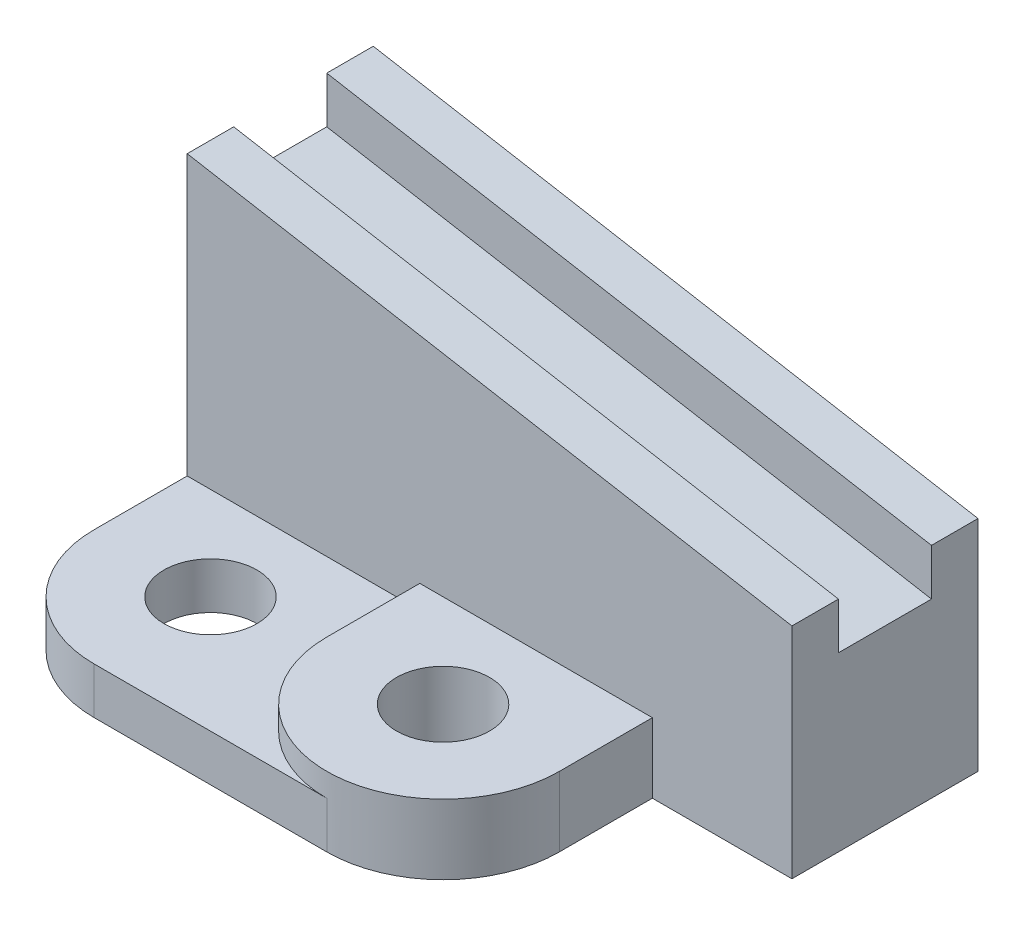
ISO-10303-21;
HEADER;
FILE_DESCRIPTION(('STEP AP214'),'2;1');
FILE_NAME('part.step','',(''),(''),'','','');
FILE_SCHEMA(('AUTOMOTIVE_DESIGN { 1 0 10303 214 1 1 1 1 }'));
ENDSEC;
DATA;
#1=APPLICATION_CONTEXT('core data for automotive mechanical design processes');
#2=APPLICATION_PROTOCOL_DEFINITION('international standard','automotive_design',2000,#1);
#3=PRODUCT_CONTEXT('',#1,'mechanical');
#4=PRODUCT('Part','Part','',(#3));
#5=PRODUCT_RELATED_PRODUCT_CATEGORY('part','',(#4));
#6=PRODUCT_DEFINITION_FORMATION('','',#4);
#7=PRODUCT_DEFINITION_CONTEXT('part definition',#1,'design');
#8=PRODUCT_DEFINITION('design','',#6,#7);
#9=PRODUCT_DEFINITION_SHAPE('','',#8);
#10=(LENGTH_UNIT() NAMED_UNIT(*) SI_UNIT(.MILLI.,.METRE.));
#11=(NAMED_UNIT(*) PLANE_ANGLE_UNIT() SI_UNIT($,.RADIAN.));
#12=(NAMED_UNIT(*) SI_UNIT($,.STERADIAN.) SOLID_ANGLE_UNIT());
#13=UNCERTAINTY_MEASURE_WITH_UNIT(LENGTH_MEASURE(1.E-05),#10,'distance_accuracy_value','');
#14=(GEOMETRIC_REPRESENTATION_CONTEXT(3) GLOBAL_UNCERTAINTY_ASSIGNED_CONTEXT((#13)) GLOBAL_UNIT_ASSIGNED_CONTEXT((#10,
#11,#12)) REPRESENTATION_CONTEXT('',''));
#15=CARTESIAN_POINT('',(0.,0.,0.));
#16=DIRECTION('',(0.,0.,1.));
#17=DIRECTION('',(1.,0.,0.));
#18=AXIS2_PLACEMENT_3D('',#15,#16,#17);
#19=CARTESIAN_POINT('',(0.,70.,40.));
#20=DIRECTION('',(0.,0.,-1.));
#21=DIRECTION('',(-1.,0.,0.));
#22=AXIS2_PLACEMENT_3D('',#19,#20,#21);
#23=PLANE('',#22);
#24=DIRECTION('',(1.,0.,0.));
#25=VECTOR('',#24,1.);
#26=CARTESIAN_POINT('',(0.,15.,40.));
#27=LINE('',#26,#25);
#28=CARTESIAN_POINT('',(50.,15.,40.));
#29=VERTEX_POINT('',#28);
#30=CARTESIAN_POINT('',(100.,15.,40.));
#31=VERTEX_POINT('',#30);
#32=EDGE_CURVE('E159',#29,#31,#27,.T.);
#33=ORIENTED_EDGE('',*,*,#32,.T.);
#34=DIRECTION('',(0.,-1.,0.));
#35=VECTOR('',#34,1.);
#36=CARTESIAN_POINT('',(100.,10.,40.));
#37=LINE('',#36,#35);
#38=CARTESIAN_POINT('',(100.,0.,40.));
#39=VERTEX_POINT('',#38);
#40=EDGE_CURVE('E51',#31,#39,#37,.T.);
#41=ORIENTED_EDGE('',*,*,#40,.T.);
#42=DIRECTION('',(1.,0.,0.));
#43=VECTOR('',#42,1.);
#44=CARTESIAN_POINT('',(0.,0.,40.));
#45=LINE('',#44,#43);
#46=CARTESIAN_POINT('',(130.,0.,40.));
#47=VERTEX_POINT('',#46);
#48=EDGE_CURVE('E236',#39,#47,#45,.T.);
#49=ORIENTED_EDGE('',*,*,#48,.T.);
#50=DIRECTION('',(0.,-1.,0.));
#51=VECTOR('',#50,1.);
#52=CARTESIAN_POINT('',(130.,70.,40.));
#53=LINE('',#52,#51);
#54=CARTESIAN_POINT('',(130.,47.0774925079001,40.));
#55=VERTEX_POINT('',#54);
#56=EDGE_CURVE('E245',#55,#47,#53,.T.);
#57=ORIENTED_EDGE('',*,*,#56,.F.);
#58=DIRECTION('',(-0.984807753012209,0.173648177666927,0.));
#59=VECTOR('',#58,1.);
#60=CARTESIAN_POINT('',(0.,70.,40.));
#61=LINE('',#60,#59);
#62=CARTESIAN_POINT('',(0.,70.,40.));
#63=VERTEX_POINT('',#62);
#64=EDGE_CURVE('E223',#55,#63,#61,.T.);
#65=ORIENTED_EDGE('',*,*,#64,.T.);
#66=DIRECTION('',(0.,-1.,0.));
#67=VECTOR('',#66,1.);
#68=CARTESIAN_POINT('',(0.,70.,40.));
#69=LINE('',#68,#67);
#70=CARTESIAN_POINT('',(0.,10.,40.));
#71=VERTEX_POINT('',#70);
#72=EDGE_CURVE('E243',#63,#71,#69,.T.);
#73=ORIENTED_EDGE('',*,*,#72,.T.);
#74=DIRECTION('',(1.,0.,0.));
#75=VECTOR('',#74,1.);
#76=CARTESIAN_POINT('',(0.,10.,40.));
#77=LINE('',#76,#75);
#78=CARTESIAN_POINT('',(50.,10.,40.));
#79=VERTEX_POINT('',#78);
#80=EDGE_CURVE('E177',#71,#79,#77,.T.);
#81=ORIENTED_EDGE('',*,*,#80,.T.);
#82=DIRECTION('',(0.,-1.,0.));
#83=VECTOR('',#82,1.);
#84=CARTESIAN_POINT('',(50.,15.,40.));
#85=LINE('',#84,#83);
#86=EDGE_CURVE('E58',#29,#79,#85,.T.);
#87=ORIENTED_EDGE('',*,*,#86,.F.);
#88=EDGE_LOOP('',(#33,#41,#49,#57,#65,#73,#81,#87));
#89=FACE_BOUND('',#88,.T.);
#90=ADVANCED_FACE('F36',(#89),#23,.F.);
#91=CARTESIAN_POINT('',(0.,10.,0.));
#92=DIRECTION('',(0.,1.,0.));
#93=DIRECTION('',(0.,0.,1.));
#94=AXIS2_PLACEMENT_3D('',#91,#92,#93);
#95=PLANE('',#94);
#96=CARTESIAN_POINT('',(25.,10.,60.));
#97=DIRECTION('',(0.,1.,0.));
#98=DIRECTION('',(0.,0.,1.));
#99=AXIS2_PLACEMENT_3D('',#96,#97,#98);
#100=CIRCLE('',#99,10.);
#101=CARTESIAN_POINT('',(25.,10.,70.));
#102=VERTEX_POINT('',#101);
#103=EDGE_CURVE('E184',#102,#102,#100,.T.);
#104=ORIENTED_EDGE('',*,*,#103,.F.);
#105=EDGE_LOOP('',(#104));
#106=FACE_BOUND('',#105,.T.);
#107=DIRECTION('',(1.,0.,0.));
#108=VECTOR('',#107,1.);
#109=CARTESIAN_POINT('',(0.,10.,85.));
#110=LINE('',#109,#108);
#111=CARTESIAN_POINT('',(25.,10.,85.));
#112=VERTEX_POINT('',#111);
#113=CARTESIAN_POINT('',(75.,10.,85.));
#114=VERTEX_POINT('',#113);
#115=EDGE_CURVE('E175',#112,#114,#110,.T.);
#116=ORIENTED_EDGE('',*,*,#115,.T.);
#117=CARTESIAN_POINT('',(75.,10.,60.));
#118=DIRECTION('',(0.,1.,0.));
#119=DIRECTION('',(0.,0.,1.));
#120=AXIS2_PLACEMENT_3D('',#117,#118,#119);
#121=CIRCLE('',#120,25.);
#122=CARTESIAN_POINT('',(50.,10.,60.));
#123=VERTEX_POINT('',#122);
#124=EDGE_CURVE('E11',#114,#123,#121,.F.);
#125=ORIENTED_EDGE('',*,*,#124,.T.);
#126=DIRECTION('',(0.,0.,1.));
#127=VECTOR('',#126,1.);
#128=CARTESIAN_POINT('',(50.,10.,0.));
#129=LINE('',#128,#127);
#130=EDGE_CURVE('E44',#79,#123,#129,.T.);
#131=ORIENTED_EDGE('',*,*,#130,.F.);
#132=ORIENTED_EDGE('',*,*,#80,.F.);
#133=DIRECTION('',(0.,0.,1.));
#134=VECTOR('',#133,1.);
#135=CARTESIAN_POINT('',(0.,10.,0.));
#136=LINE('',#135,#134);
#137=CARTESIAN_POINT('',(0.,10.,60.));
#138=VERTEX_POINT('',#137);
#139=EDGE_CURVE('E180',#71,#138,#136,.T.);
#140=ORIENTED_EDGE('',*,*,#139,.T.);
#141=CARTESIAN_POINT('',(25.,10.,60.));
#142=DIRECTION('',(0.,1.,0.));
#143=DIRECTION('',(0.,0.,1.));
#144=AXIS2_PLACEMENT_3D('',#141,#142,#143);
#145=CIRCLE('',#144,25.);
#146=EDGE_CURVE('E182',#138,#112,#145,.T.);
#147=ORIENTED_EDGE('',*,*,#146,.T.);
#148=EDGE_LOOP('',(#116,#125,#131,#132,#140,#147));
#149=FACE_BOUND('',#148,.T.);
#150=ADVANCED_FACE('F280',(#106,#149),#95,.T.);
#151=CARTESIAN_POINT('',(0.,70.,0.));
#152=DIRECTION('',(1.,0.,0.));
#153=DIRECTION('',(0.,0.,-1.));
#154=AXIS2_PLACEMENT_3D('',#151,#152,#153);
#155=PLANE('',#154);
#156=DIRECTION('',(0.,0.,1.));
#157=VECTOR('',#156,1.);
#158=CARTESIAN_POINT('',(0.,0.,0.));
#159=LINE('',#158,#157);
#160=CARTESIAN_POINT('',(0.,0.,0.));
#161=VERTEX_POINT('',#160);
#162=CARTESIAN_POINT('',(0.,0.,60.));
#163=VERTEX_POINT('',#162);
#164=EDGE_CURVE('E248',#161,#163,#159,.T.);
#165=ORIENTED_EDGE('',*,*,#164,.T.);
#166=DIRECTION('',(0.,-1.,0.));
#167=VECTOR('',#166,1.);
#168=CARTESIAN_POINT('',(0.,10.,60.));
#169=LINE('',#168,#167);
#170=EDGE_CURVE('E202',#138,#163,#169,.T.);
#171=ORIENTED_EDGE('',*,*,#170,.F.);
#172=ORIENTED_EDGE('',*,*,#139,.F.);
#173=ORIENTED_EDGE('',*,*,#72,.F.);
#174=DIRECTION('',(0.,0.,1.));
#175=VECTOR('',#174,1.);
#176=CARTESIAN_POINT('',(0.,70.,0.));
#177=LINE('',#176,#175);
#178=CARTESIAN_POINT('',(0.,70.,30.));
#179=VERTEX_POINT('',#178);
#180=EDGE_CURVE('E238',#179,#63,#177,.T.);
#181=ORIENTED_EDGE('',*,*,#180,.F.);
#182=DIRECTION('',(0.,-1.,0.));
#183=VECTOR('',#182,1.);
#184=CARTESIAN_POINT('',(0.,70.,30.));
#185=LINE('',#184,#183);
#186=CARTESIAN_POINT('',(0.,60.,30.));
#187=VERTEX_POINT('',#186);
#188=EDGE_CURVE('E239',#179,#187,#185,.T.);
#189=ORIENTED_EDGE('',*,*,#188,.T.);
#190=DIRECTION('',(0.,0.,1.));
#191=VECTOR('',#190,1.);
#192=CARTESIAN_POINT('',(0.,60.,10.));
#193=LINE('',#192,#191);
#194=CARTESIAN_POINT('',(0.,60.,10.));
#195=VERTEX_POINT('',#194);
#196=EDGE_CURVE('E210',#195,#187,#193,.T.);
#197=ORIENTED_EDGE('',*,*,#196,.F.);
#198=DIRECTION('',(0.,-1.,0.));
#199=VECTOR('',#198,1.);
#200=CARTESIAN_POINT('',(0.,70.,10.));
#201=LINE('',#200,#199);
#202=CARTESIAN_POINT('',(0.,70.,10.));
#203=VERTEX_POINT('',#202);
#204=EDGE_CURVE('E265',#203,#195,#201,.T.);
#205=ORIENTED_EDGE('',*,*,#204,.F.);
#206=DIRECTION('',(0.,0.,1.));
#207=VECTOR('',#206,1.);
#208=CARTESIAN_POINT('',(0.,70.,0.));
#209=LINE('',#208,#207);
#210=CARTESIAN_POINT('',(0.,70.,0.));
#211=VERTEX_POINT('',#210);
#212=EDGE_CURVE('E249',#211,#203,#209,.T.);
#213=ORIENTED_EDGE('',*,*,#212,.F.);
#214=DIRECTION('',(0.,-1.,0.));
#215=VECTOR('',#214,1.);
#216=CARTESIAN_POINT('',(0.,70.,0.));
#217=LINE('',#216,#215);
#218=EDGE_CURVE('E251',#211,#161,#217,.T.);
#219=ORIENTED_EDGE('',*,*,#218,.T.);
#220=EDGE_LOOP('',(#165,#171,#172,#173,#181,#189,#197,#205,#213,#219));
#221=FACE_BOUND('',#220,.T.);
#222=ADVANCED_FACE('F38',(#221),#155,.F.);
#223=CARTESIAN_POINT('',(0.,70.,10.));
#224=DIRECTION('',(0.,0.,-1.));
#225=DIRECTION('',(-1.,0.,0.));
#226=AXIS2_PLACEMENT_3D('',#223,#224,#225);
#227=PLANE('',#226);
#228=ORIENTED_EDGE('',*,*,#204,.T.);
#229=DIRECTION('',(-0.984807753012209,0.173648177666926,0.));
#230=VECTOR('',#229,1.);
#231=CARTESIAN_POINT('',(0.,60.,10.));
#232=LINE('',#231,#230);
#233=CARTESIAN_POINT('',(130.,37.0774925079001,10.));
#234=VERTEX_POINT('',#233);
#235=EDGE_CURVE('E207',#234,#195,#232,.T.);
#236=ORIENTED_EDGE('',*,*,#235,.F.);
#237=DIRECTION('',(0.,-1.,0.));
#238=VECTOR('',#237,1.);
#239=CARTESIAN_POINT('',(130.,70.,10.));
#240=LINE('',#239,#238);
#241=CARTESIAN_POINT('',(130.,47.0774925079001,10.));
#242=VERTEX_POINT('',#241);
#243=EDGE_CURVE('E262',#242,#234,#240,.T.);
#244=ORIENTED_EDGE('',*,*,#243,.F.);
#245=DIRECTION('',(-0.984807753012209,0.173648177666927,0.));
#246=VECTOR('',#245,1.);
#247=CARTESIAN_POINT('',(0.,70.,10.));
#248=LINE('',#247,#246);
#249=EDGE_CURVE('E230',#242,#203,#248,.T.);
#250=ORIENTED_EDGE('',*,*,#249,.T.);
#251=EDGE_LOOP('',(#228,#236,#244,#250));
#252=FACE_BOUND('',#251,.T.);
#253=ADVANCED_FACE('F309',(#252),#227,.F.);
#254=CARTESIAN_POINT('',(130.,70.,0.));
#255=DIRECTION('',(1.,0.,0.));
#256=DIRECTION('',(0.,0.,-1.));
#257=AXIS2_PLACEMENT_3D('',#254,#255,#256);
#258=PLANE('',#257);
#259=DIRECTION('',(0.,0.,1.));
#260=VECTOR('',#259,1.);
#261=CARTESIAN_POINT('',(130.,37.0774925079001,0.));
#262=LINE('',#261,#260);
#263=CARTESIAN_POINT('',(130.,37.0774925079001,30.));
#264=VERTEX_POINT('',#263);
#265=EDGE_CURVE('E233',#234,#264,#262,.T.);
#266=ORIENTED_EDGE('',*,*,#265,.T.);
#267=DIRECTION('',(0.,-1.,0.));
#268=VECTOR('',#267,1.);
#269=CARTESIAN_POINT('',(130.,70.,30.));
#270=LINE('',#269,#268);
#271=CARTESIAN_POINT('',(130.,47.0774925079001,30.));
#272=VERTEX_POINT('',#271);
#273=EDGE_CURVE('E242',#272,#264,#270,.T.);
#274=ORIENTED_EDGE('',*,*,#273,.F.);
#275=DIRECTION('',(0.,0.,1.));
#276=VECTOR('',#275,1.);
#277=CARTESIAN_POINT('',(130.,47.0774925079001,0.));
#278=LINE('',#277,#276);
#279=EDGE_CURVE('E219',#272,#55,#278,.T.);
#280=ORIENTED_EDGE('',*,*,#279,.T.);
#281=ORIENTED_EDGE('',*,*,#56,.T.);
#282=DIRECTION('',(0.,0.,1.));
#283=VECTOR('',#282,1.);
#284=CARTESIAN_POINT('',(130.,0.,0.));
#285=LINE('',#284,#283);
#286=CARTESIAN_POINT('',(130.,0.,0.));
#287=VERTEX_POINT('',#286);
#288=EDGE_CURVE('E254',#287,#47,#285,.T.);
#289=ORIENTED_EDGE('',*,*,#288,.F.);
#290=DIRECTION('',(0.,-1.,0.));
#291=VECTOR('',#290,1.);
#292=CARTESIAN_POINT('',(130.,70.,0.));
#293=LINE('',#292,#291);
#294=CARTESIAN_POINT('',(130.,47.0774925079001,0.));
#295=VERTEX_POINT('',#294);
#296=EDGE_CURVE('E260',#295,#287,#293,.T.);
#297=ORIENTED_EDGE('',*,*,#296,.F.);
#298=EDGE_CURVE('E220',#295,#242,#278,.T.);
#299=ORIENTED_EDGE('',*,*,#298,.T.);
#300=ORIENTED_EDGE('',*,*,#243,.T.);
#301=EDGE_LOOP('',(#266,#274,#280,#281,#289,#297,#299,#300));
#302=FACE_BOUND('',#301,.T.);
#303=ADVANCED_FACE('F297',(#302),#258,.T.);
#304=CARTESIAN_POINT('',(0.,70.,0.));
#305=DIRECTION('',(0.,0.,-1.));
#306=DIRECTION('',(-1.,0.,0.));
#307=AXIS2_PLACEMENT_3D('',#304,#305,#306);
#308=PLANE('',#307);
#309=DIRECTION('',(0.984807753012209,-0.173648177666927,0.));
#310=VECTOR('',#309,1.);
#311=CARTESIAN_POINT('',(11.9707050163981,67.8892417275069,0.));
#312=LINE('',#311,#310);
#313=EDGE_CURVE('E216',#211,#295,#312,.T.);
#314=ORIENTED_EDGE('',*,*,#313,.T.);
#315=ORIENTED_EDGE('',*,*,#296,.T.);
#316=DIRECTION('',(1.,0.,0.));
#317=VECTOR('',#316,1.);
#318=CARTESIAN_POINT('',(0.,0.,0.));
#319=LINE('',#318,#317);
#320=EDGE_CURVE('E252',#161,#287,#319,.T.);
#321=ORIENTED_EDGE('',*,*,#320,.F.);
#322=ORIENTED_EDGE('',*,*,#218,.F.);
#323=EDGE_LOOP('',(#314,#315,#321,#322));
#324=FACE_BOUND('',#323,.T.);
#325=ADVANCED_FACE('F303',(#324),#308,.T.);
#326=CARTESIAN_POINT('',(0.,0.,0.));
#327=DIRECTION('',(0.,1.,0.));
#328=DIRECTION('',(0.,0.,1.));
#329=AXIS2_PLACEMENT_3D('',#326,#327,#328);
#330=PLANE('',#329);
#331=CARTESIAN_POINT('',(75.,0.,60.));
#332=DIRECTION('',(0.,1.,0.));
#333=DIRECTION('',(0.,0.,1.));
#334=AXIS2_PLACEMENT_3D('',#331,#332,#333);
#335=CIRCLE('',#334,25.);
#336=CARTESIAN_POINT('',(75.,0.,85.));
#337=VERTEX_POINT('',#336);
#338=CARTESIAN_POINT('',(100.,0.,60.));
#339=VERTEX_POINT('',#338);
#340=EDGE_CURVE('E151',#337,#339,#335,.T.);
#341=ORIENTED_EDGE('',*,*,#340,.F.);
#342=DIRECTION('',(1.,0.,0.));
#343=VECTOR('',#342,1.);
#344=CARTESIAN_POINT('',(0.,0.,85.));
#345=LINE('',#344,#343);
#346=CARTESIAN_POINT('',(25.,0.,85.));
#347=VERTEX_POINT('',#346);
#348=EDGE_CURVE('E174',#347,#337,#345,.T.);
#349=ORIENTED_EDGE('',*,*,#348,.F.);
#350=CARTESIAN_POINT('',(25.,0.,60.));
#351=DIRECTION('',(0.,1.,0.));
#352=DIRECTION('',(0.,0.,1.));
#353=AXIS2_PLACEMENT_3D('',#350,#351,#352);
#354=CIRCLE('',#353,25.);
#355=EDGE_CURVE('E193',#163,#347,#354,.T.);
#356=ORIENTED_EDGE('',*,*,#355,.F.);
#357=ORIENTED_EDGE('',*,*,#164,.F.);
#358=ORIENTED_EDGE('',*,*,#320,.T.);
#359=ORIENTED_EDGE('',*,*,#288,.T.);
#360=ORIENTED_EDGE('',*,*,#48,.F.);
#361=DIRECTION('',(0.,0.,-1.));
#362=VECTOR('',#361,1.);
#363=CARTESIAN_POINT('',(100.,0.,0.));
#364=LINE('',#363,#362);
#365=EDGE_CURVE('E191',#339,#39,#364,.T.);
#366=ORIENTED_EDGE('',*,*,#365,.F.);
#367=EDGE_LOOP('',(#341,#349,#356,#357,#358,#359,#360,#366));
#368=FACE_BOUND('',#367,.T.);
#369=CARTESIAN_POINT('',(75.,0.,60.));
#370=DIRECTION('',(0.,1.,0.));
#371=DIRECTION('',(0.,0.,1.));
#372=AXIS2_PLACEMENT_3D('',#369,#370,#371);
#373=CIRCLE('',#372,9.99999999999999);
#374=CARTESIAN_POINT('',(75.,0.,70.));
#375=VERTEX_POINT('',#374);
#376=EDGE_CURVE('E178',#375,#375,#373,.T.);
#377=ORIENTED_EDGE('',*,*,#376,.T.);
#378=EDGE_LOOP('',(#377));
#379=FACE_BOUND('',#378,.T.);
#380=CARTESIAN_POINT('',(25.,0.,60.));
#381=DIRECTION('',(0.,1.,0.));
#382=DIRECTION('',(0.,0.,1.));
#383=AXIS2_PLACEMENT_3D('',#380,#381,#382);
#384=CIRCLE('',#383,10.);
#385=CARTESIAN_POINT('',(25.,0.,70.));
#386=VERTEX_POINT('',#385);
#387=EDGE_CURVE('E195',#386,#386,#384,.T.);
#388=ORIENTED_EDGE('',*,*,#387,.T.);
#389=EDGE_LOOP('',(#388));
#390=FACE_BOUND('',#389,.T.);
#391=ADVANCED_FACE('F289',(#368,#379,#390),#330,.F.);
#392=CARTESIAN_POINT('',(0.,70.,30.));
#393=DIRECTION('',(0.,0.,-1.));
#394=DIRECTION('',(-1.,0.,0.));
#395=AXIS2_PLACEMENT_3D('',#392,#393,#394);
#396=PLANE('',#395);
#397=DIRECTION('',(0.984807753012209,-0.173648177666926,0.));
#398=VECTOR('',#397,1.);
#399=CARTESIAN_POINT('',(-1.71010071662831,60.3015368960704,30.));
#400=LINE('',#399,#398);
#401=EDGE_CURVE('E213',#187,#264,#400,.T.);
#402=ORIENTED_EDGE('',*,*,#401,.F.);
#403=ORIENTED_EDGE('',*,*,#188,.F.);
#404=DIRECTION('',(-0.984807753012209,0.173648177666927,0.));
#405=VECTOR('',#404,1.);
#406=CARTESIAN_POINT('',(0.,70.,30.));
#407=LINE('',#406,#405);
#408=EDGE_CURVE('E226',#272,#179,#407,.T.);
#409=ORIENTED_EDGE('',*,*,#408,.F.);
#410=ORIENTED_EDGE('',*,*,#273,.T.);
#411=EDGE_LOOP('',(#402,#403,#409,#410));
#412=FACE_BOUND('',#411,.T.);
#413=ADVANCED_FACE('F316',(#412),#396,.T.);
#414=CARTESIAN_POINT('',(11.9707050163981,67.8892417275069,0.));
#415=DIRECTION('',(-0.173648177666927,-0.984807753012209,0.));
#416=DIRECTION('',(0.984807753012209,-0.173648177666927,0.));
#417=AXIS2_PLACEMENT_3D('',#414,#415,#416);
#418=PLANE('',#417);
#419=ORIENTED_EDGE('',*,*,#408,.T.);
#420=ORIENTED_EDGE('',*,*,#180,.T.);
#421=ORIENTED_EDGE('',*,*,#64,.F.);
#422=ORIENTED_EDGE('',*,*,#279,.F.);
#423=EDGE_LOOP('',(#419,#420,#421,#422));
#424=FACE_BOUND('',#423,.T.);
#425=ADVANCED_FACE('F320',(#424),#418,.F.);
#426=ORIENTED_EDGE('',*,*,#298,.F.);
#427=ORIENTED_EDGE('',*,*,#313,.F.);
#428=ORIENTED_EDGE('',*,*,#212,.T.);
#429=ORIENTED_EDGE('',*,*,#249,.F.);
#430=EDGE_LOOP('',(#426,#427,#428,#429));
#431=FACE_BOUND('',#430,.T.);
#432=ADVANCED_FACE('F451',(#431),#418,.F.);
#433=CARTESIAN_POINT('',(0.,60.,10.));
#434=DIRECTION('',(0.173648177666926,0.984807753012209,0.));
#435=DIRECTION('',(-0.984807753012209,0.173648177666926,0.));
#436=AXIS2_PLACEMENT_3D('',#433,#434,#435);
#437=PLANE('',#436);
#438=ORIENTED_EDGE('',*,*,#196,.T.);
#439=ORIENTED_EDGE('',*,*,#401,.T.);
#440=ORIENTED_EDGE('',*,*,#265,.F.);
#441=ORIENTED_EDGE('',*,*,#235,.T.);
#442=EDGE_LOOP('',(#438,#439,#440,#441));
#443=FACE_BOUND('',#442,.T.);
#444=ADVANCED_FACE('F313',(#443),#437,.T.);
#445=CARTESIAN_POINT('',(0.,10.,85.));
#446=DIRECTION('',(0.,0.,-1.));
#447=DIRECTION('',(-1.,0.,0.));
#448=AXIS2_PLACEMENT_3D('',#445,#446,#447);
#449=PLANE('',#448);
#450=ORIENTED_EDGE('',*,*,#348,.T.);
#451=DIRECTION('',(0.,-1.,0.));
#452=VECTOR('',#451,1.);
#453=CARTESIAN_POINT('',(75.,10.,85.));
#454=LINE('',#453,#452);
#455=EDGE_CURVE('E153',#114,#337,#454,.T.);
#456=ORIENTED_EDGE('',*,*,#455,.F.);
#457=ORIENTED_EDGE('',*,*,#115,.F.);
#458=DIRECTION('',(0.,-1.,0.));
#459=VECTOR('',#458,1.);
#460=CARTESIAN_POINT('',(25.,10.,85.));
#461=LINE('',#460,#459);
#462=EDGE_CURVE('E187',#112,#347,#461,.T.);
#463=ORIENTED_EDGE('',*,*,#462,.T.);
#464=EDGE_LOOP('',(#450,#456,#457,#463));
#465=FACE_BOUND('',#464,.T.);
#466=ADVANCED_FACE('F285',(#465),#449,.F.);
#467=CARTESIAN_POINT('',(75.,10.,60.));
#468=DIRECTION('',(0.,-1.,0.));
#469=DIRECTION('',(0.,0.,-1.));
#470=AXIS2_PLACEMENT_3D('',#467,#468,#469);
#471=CYLINDRICAL_SURFACE('',#470,25.);
#472=ORIENTED_EDGE('',*,*,#340,.T.);
#473=DIRECTION('',(0.,-1.,0.));
#474=VECTOR('',#473,1.);
#475=CARTESIAN_POINT('',(100.,10.,60.));
#476=LINE('',#475,#474);
#477=CARTESIAN_POINT('',(100.,15.,60.));
#478=VERTEX_POINT('',#477);
#479=EDGE_CURVE('E144',#478,#339,#476,.T.);
#480=ORIENTED_EDGE('',*,*,#479,.F.);
#481=CARTESIAN_POINT('',(75.,15.,60.));
#482=DIRECTION('',(0.,1.,0.));
#483=DIRECTION('',(0.,0.,1.));
#484=AXIS2_PLACEMENT_3D('',#481,#482,#483);
#485=CIRCLE('',#484,25.);
#486=CARTESIAN_POINT('',(50.,15.,60.));
#487=VERTEX_POINT('',#486);
#488=EDGE_CURVE('E148',#487,#478,#485,.T.);
#489=ORIENTED_EDGE('',*,*,#488,.F.);
#490=DIRECTION('',(0.,-1.,0.));
#491=VECTOR('',#490,1.);
#492=CARTESIAN_POINT('',(50.,15.,60.));
#493=LINE('',#492,#491);
#494=EDGE_CURVE('E171',#487,#123,#493,.T.);
#495=ORIENTED_EDGE('',*,*,#494,.T.);
#496=ORIENTED_EDGE('',*,*,#124,.F.);
#497=ORIENTED_EDGE('',*,*,#455,.T.);
#498=EDGE_LOOP('',(#472,#480,#489,#495,#496,#497));
#499=FACE_BOUND('',#498,.T.);
#500=ADVANCED_FACE('F145',(#499),#471,.T.);
#501=CARTESIAN_POINT('',(100.,10.,0.));
#502=DIRECTION('',(-1.,0.,0.));
#503=DIRECTION('',(0.,0.,1.));
#504=AXIS2_PLACEMENT_3D('',#501,#502,#503);
#505=PLANE('',#504);
#506=ORIENTED_EDGE('',*,*,#365,.T.);
#507=ORIENTED_EDGE('',*,*,#40,.F.);
#508=DIRECTION('',(0.,0.,-1.));
#509=VECTOR('',#508,1.);
#510=CARTESIAN_POINT('',(100.,15.,0.));
#511=LINE('',#510,#509);
#512=EDGE_CURVE('E156',#478,#31,#511,.T.);
#513=ORIENTED_EDGE('',*,*,#512,.F.);
#514=ORIENTED_EDGE('',*,*,#479,.T.);
#515=EDGE_LOOP('',(#506,#507,#513,#514));
#516=FACE_BOUND('',#515,.T.);
#517=ADVANCED_FACE('F157',(#516),#505,.F.);
#518=CARTESIAN_POINT('',(25.,10.,60.));
#519=DIRECTION('',(0.,-1.,0.));
#520=DIRECTION('',(0.,0.,-1.));
#521=AXIS2_PLACEMENT_3D('',#518,#519,#520);
#522=CYLINDRICAL_SURFACE('',#521,10.);
#523=ORIENTED_EDGE('',*,*,#103,.T.);
#524=EDGE_LOOP('',(#523));
#525=FACE_BOUND('',#524,.T.);
#526=ORIENTED_EDGE('',*,*,#387,.F.);
#527=EDGE_LOOP('',(#526));
#528=FACE_BOUND('',#527,.T.);
#529=ADVANCED_FACE('F328',(#525,#528),#522,.F.);
#530=CARTESIAN_POINT('',(25.,10.,60.));
#531=DIRECTION('',(0.,-1.,0.));
#532=DIRECTION('',(0.,0.,-1.));
#533=AXIS2_PLACEMENT_3D('',#530,#531,#532);
#534=CYLINDRICAL_SURFACE('',#533,25.);
#535=ORIENTED_EDGE('',*,*,#355,.T.);
#536=ORIENTED_EDGE('',*,*,#462,.F.);
#537=ORIENTED_EDGE('',*,*,#146,.F.);
#538=ORIENTED_EDGE('',*,*,#170,.T.);
#539=EDGE_LOOP('',(#535,#536,#537,#538));
#540=FACE_BOUND('',#539,.T.);
#541=ADVANCED_FACE('F325',(#540),#534,.T.);
#542=CARTESIAN_POINT('',(75.,10.,60.));
#543=DIRECTION('',(0.,-1.,0.));
#544=DIRECTION('',(0.,0.,-1.));
#545=AXIS2_PLACEMENT_3D('',#542,#543,#544);
#546=CYLINDRICAL_SURFACE('',#545,9.99999999999999);
#547=ORIENTED_EDGE('',*,*,#376,.F.);
#548=EDGE_LOOP('',(#547));
#549=FACE_BOUND('',#548,.T.);
#550=CARTESIAN_POINT('',(75.,15.,60.));
#551=DIRECTION('',(0.,1.,0.));
#552=DIRECTION('',(0.,0.,1.));
#553=AXIS2_PLACEMENT_3D('',#550,#551,#552);
#554=CIRCLE('',#553,9.99999999999999);
#555=CARTESIAN_POINT('',(75.,15.,70.));
#556=VERTEX_POINT('',#555);
#557=EDGE_CURVE('E164',#556,#556,#554,.T.);
#558=ORIENTED_EDGE('',*,*,#557,.T.);
#559=EDGE_LOOP('',(#558));
#560=FACE_BOUND('',#559,.T.);
#561=ADVANCED_FACE('F327',(#549,#560),#546,.F.);
#562=CARTESIAN_POINT('',(50.,15.,0.));
#563=DIRECTION('',(-1.,0.,0.));
#564=DIRECTION('',(0.,0.,1.));
#565=AXIS2_PLACEMENT_3D('',#562,#563,#564);
#566=PLANE('',#565);
#567=ORIENTED_EDGE('',*,*,#86,.T.);
#568=ORIENTED_EDGE('',*,*,#130,.T.);
#569=ORIENTED_EDGE('',*,*,#494,.F.);
#570=DIRECTION('',(0.,0.,-1.));
#571=VECTOR('',#570,1.);
#572=CARTESIAN_POINT('',(50.,15.,0.));
#573=LINE('',#572,#571);
#574=EDGE_CURVE('E163',#487,#29,#573,.T.);
#575=ORIENTED_EDGE('',*,*,#574,.T.);
#576=EDGE_LOOP('',(#567,#568,#569,#575));
#577=FACE_BOUND('',#576,.T.);
#578=ADVANCED_FACE('F275',(#577),#566,.T.);
#579=CARTESIAN_POINT('',(0.,15.,0.));
#580=DIRECTION('',(0.,1.,0.));
#581=DIRECTION('',(0.,0.,1.));
#582=AXIS2_PLACEMENT_3D('',#579,#580,#581);
#583=PLANE('',#582);
#584=ORIENTED_EDGE('',*,*,#557,.F.);
#585=EDGE_LOOP('',(#584));
#586=FACE_BOUND('',#585,.T.);
#587=ORIENTED_EDGE('',*,*,#488,.T.);
#588=ORIENTED_EDGE('',*,*,#512,.T.);
#589=ORIENTED_EDGE('',*,*,#32,.F.);
#590=ORIENTED_EDGE('',*,*,#574,.F.);
#591=EDGE_LOOP('',(#587,#588,#589,#590));
#592=FACE_BOUND('',#591,.T.);
#593=ADVANCED_FACE('F161',(#586,#592),#583,.T.);
#594=CLOSED_SHELL('',(#90,#150,#222,#253,#303,#325,#391,#413,#425,#432,#444,#466,#500,#517,#529,
#541,#561,#578,#593));
#595=MANIFOLD_SOLID_BREP('B2',#594);
#596=ADVANCED_BREP_SHAPE_REPRESENTATION('',(#18,#595),#14);
#597=SHAPE_DEFINITION_REPRESENTATION(#9,#596);
ENDSEC;
END-ISO-10303-21;
